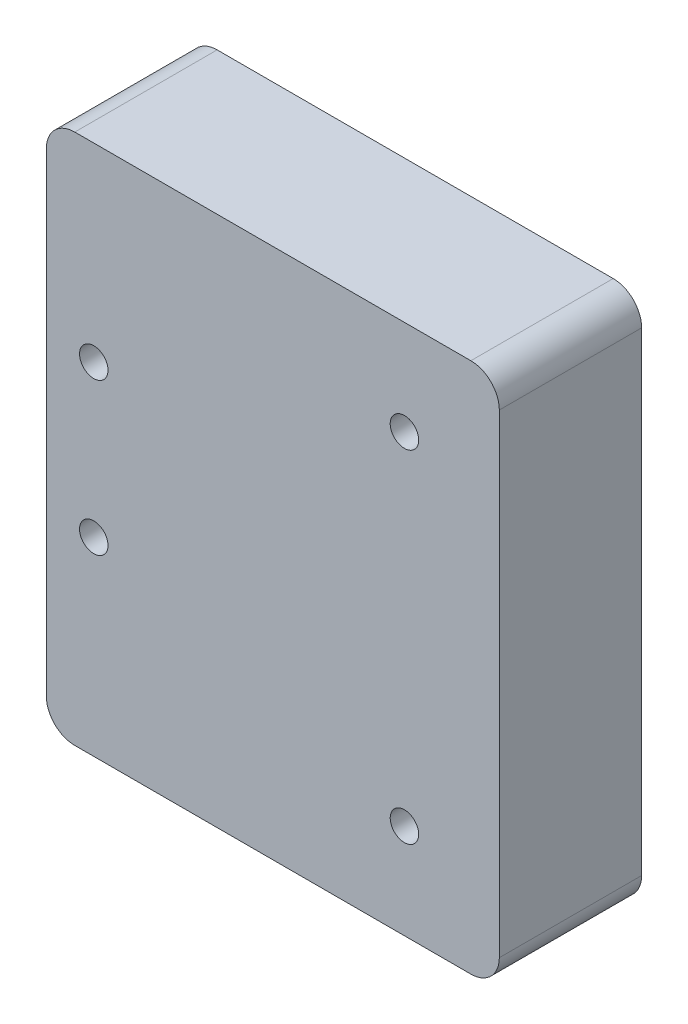
ISO-10303-21;
HEADER;
FILE_DESCRIPTION(('STEP AP214'),'2;1');
FILE_NAME('part.step','',(''),(''),'','','');
FILE_SCHEMA(('AUTOMOTIVE_DESIGN { 1 0 10303 214 1 1 1 1 }'));
ENDSEC;
DATA;
#1=APPLICATION_CONTEXT('core data for automotive mechanical design processes');
#2=APPLICATION_PROTOCOL_DEFINITION('international standard','automotive_design',2000,#1);
#3=PRODUCT_CONTEXT('',#1,'mechanical');
#4=PRODUCT('Part','Part','',(#3));
#5=PRODUCT_RELATED_PRODUCT_CATEGORY('part','',(#4));
#6=PRODUCT_DEFINITION_FORMATION('','',#4);
#7=PRODUCT_DEFINITION_CONTEXT('part definition',#1,'design');
#8=PRODUCT_DEFINITION('design','',#6,#7);
#9=PRODUCT_DEFINITION_SHAPE('','',#8);
#10=(LENGTH_UNIT() NAMED_UNIT(*) SI_UNIT(.MILLI.,.METRE.));
#11=(NAMED_UNIT(*) PLANE_ANGLE_UNIT() SI_UNIT($,.RADIAN.));
#12=(NAMED_UNIT(*) SI_UNIT($,.STERADIAN.) SOLID_ANGLE_UNIT());
#13=UNCERTAINTY_MEASURE_WITH_UNIT(LENGTH_MEASURE(1.E-05),#10,'distance_accuracy_value','');
#14=(GEOMETRIC_REPRESENTATION_CONTEXT(3) GLOBAL_UNCERTAINTY_ASSIGNED_CONTEXT((#13)) GLOBAL_UNIT_ASSIGNED_CONTEXT((#10,
#11,#12)) REPRESENTATION_CONTEXT('',''));
#15=CARTESIAN_POINT('',(0.,0.,0.));
#16=DIRECTION('',(0.,0.,1.));
#17=DIRECTION('',(1.,0.,0.));
#18=AXIS2_PLACEMENT_3D('',#15,#16,#17);
#19=CARTESIAN_POINT('',(0.,0.,15.));
#20=DIRECTION('',(0.,1.,0.));
#21=DIRECTION('',(0.,0.,1.));
#22=AXIS2_PLACEMENT_3D('',#19,#20,#21);
#23=PLANE('',#22);
#24=DIRECTION('',(1.,0.,0.));
#25=VECTOR('',#24,1.);
#26=CARTESIAN_POINT('',(0.,0.,0.));
#27=LINE('',#26,#25);
#28=CARTESIAN_POINT('',(3.,0.,0.));
#29=VERTEX_POINT('',#28);
#30=CARTESIAN_POINT('',(44.739861284283,0.,0.));
#31=VERTEX_POINT('',#30);
#32=EDGE_CURVE('E189',#29,#31,#27,.T.);
#33=ORIENTED_EDGE('',*,*,#32,.T.);
#34=DIRECTION('',(0.,0.,-1.));
#35=VECTOR('',#34,1.);
#36=CARTESIAN_POINT('',(44.739861284283,0.,15.));
#37=LINE('',#36,#35);
#38=CARTESIAN_POINT('',(44.739861284283,0.,15.));
#39=VERTEX_POINT('',#38);
#40=EDGE_CURVE('E204',#31,#39,#37,.F.);
#41=ORIENTED_EDGE('',*,*,#40,.T.);
#42=DIRECTION('',(1.,0.,0.));
#43=VECTOR('',#42,1.);
#44=CARTESIAN_POINT('',(0.,0.,15.));
#45=LINE('',#44,#43);
#46=CARTESIAN_POINT('',(3.,0.,15.));
#47=VERTEX_POINT('',#46);
#48=EDGE_CURVE('E113',#47,#39,#45,.T.);
#49=ORIENTED_EDGE('',*,*,#48,.F.);
#50=DIRECTION('',(0.,0.,-1.));
#51=VECTOR('',#50,1.);
#52=CARTESIAN_POINT('',(3.,0.,15.));
#53=LINE('',#52,#51);
#54=EDGE_CURVE('E201',#47,#29,#53,.T.);
#55=ORIENTED_EDGE('',*,*,#54,.T.);
#56=EDGE_LOOP('',(#33,#41,#49,#55));
#57=FACE_BOUND('',#56,.T.);
#58=ADVANCED_FACE('F35',(#57),#23,.F.);
#59=CARTESIAN_POINT('',(0.,0.,15.));
#60=DIRECTION('',(0.,0.,-1.));
#61=DIRECTION('',(-1.,0.,0.));
#62=AXIS2_PLACEMENT_3D('',#59,#60,#61);
#63=PLANE('',#62);
#64=CARTESIAN_POINT('',(37.739861284283,10.,15.));
#65=DIRECTION('',(0.,0.,1.));
#66=DIRECTION('',(1.,0.,0.));
#67=AXIS2_PLACEMENT_3D('',#64,#65,#66);
#68=CIRCLE('',#67,1.5);
#69=CARTESIAN_POINT('',(39.239861284283,10.,15.));
#70=VERTEX_POINT('',#69);
#71=EDGE_CURVE('E425',#70,#70,#68,.T.);
#72=ORIENTED_EDGE('',*,*,#71,.F.);
#73=EDGE_LOOP('',(#72));
#74=FACE_BOUND('',#73,.T.);
#75=CARTESIAN_POINT('',(5.,20.,15.));
#76=DIRECTION('',(0.,0.,1.));
#77=DIRECTION('',(1.,0.,0.));
#78=AXIS2_PLACEMENT_3D('',#75,#76,#77);
#79=CIRCLE('',#78,1.5);
#80=CARTESIAN_POINT('',(6.5,20.,15.));
#81=VERTEX_POINT('',#80);
#82=EDGE_CURVE('E434',#81,#81,#79,.T.);
#83=ORIENTED_EDGE('',*,*,#82,.F.);
#84=EDGE_LOOP('',(#83));
#85=FACE_BOUND('',#84,.T.);
#86=CARTESIAN_POINT('',(5.,35.9839681310592,15.));
#87=DIRECTION('',(0.,0.,1.));
#88=DIRECTION('',(1.,0.,0.));
#89=AXIS2_PLACEMENT_3D('',#86,#87,#88);
#90=CIRCLE('',#89,1.5);
#91=CARTESIAN_POINT('',(6.5,35.9839681310592,15.));
#92=VERTEX_POINT('',#91);
#93=EDGE_CURVE('E440',#92,#92,#90,.T.);
#94=ORIENTED_EDGE('',*,*,#93,.F.);
#95=EDGE_LOOP('',(#94));
#96=FACE_BOUND('',#95,.T.);
#97=CARTESIAN_POINT('',(37.739861284283,45.9839681310592,15.));
#98=DIRECTION('',(0.,0.,1.));
#99=DIRECTION('',(1.,0.,0.));
#100=AXIS2_PLACEMENT_3D('',#97,#98,#99);
#101=CIRCLE('',#100,1.5);
#102=CARTESIAN_POINT('',(39.239861284283,45.9839681310592,15.));
#103=VERTEX_POINT('',#102);
#104=EDGE_CURVE('E153',#103,#103,#101,.T.);
#105=ORIENTED_EDGE('',*,*,#104,.F.);
#106=EDGE_LOOP('',(#105));
#107=FACE_BOUND('',#106,.T.);
#108=ORIENTED_EDGE('',*,*,#48,.T.);
#109=CARTESIAN_POINT('',(44.739861284283,3.,15.));
#110=DIRECTION('',(0.,0.,-1.));
#111=DIRECTION('',(-1.,0.,0.));
#112=AXIS2_PLACEMENT_3D('',#109,#110,#111);
#113=CIRCLE('',#112,3.);
#114=CARTESIAN_POINT('',(47.739861284283,3.,15.));
#115=VERTEX_POINT('',#114);
#116=EDGE_CURVE('E120',#39,#115,#113,.F.);
#117=ORIENTED_EDGE('',*,*,#116,.T.);
#118=DIRECTION('',(0.,-1.,0.));
#119=VECTOR('',#118,1.);
#120=CARTESIAN_POINT('',(47.739861284283,60.,15.));
#121=LINE('',#120,#119);
#122=CARTESIAN_POINT('',(47.739861284283,52.9839681310592,15.));
#123=VERTEX_POINT('',#122);
#124=EDGE_CURVE('E106',#123,#115,#121,.T.);
#125=ORIENTED_EDGE('',*,*,#124,.F.);
#126=CARTESIAN_POINT('',(44.739861284283,52.9839681310592,15.));
#127=DIRECTION('',(0.,0.,-1.));
#128=DIRECTION('',(-1.,0.,0.));
#129=AXIS2_PLACEMENT_3D('',#126,#127,#128);
#130=CIRCLE('',#129,3.);
#131=CARTESIAN_POINT('',(44.739861284283,55.9839681310592,15.));
#132=VERTEX_POINT('',#131);
#133=EDGE_CURVE('E117',#123,#132,#130,.F.);
#134=ORIENTED_EDGE('',*,*,#133,.T.);
#135=DIRECTION('',(-1.,0.,0.));
#136=VECTOR('',#135,1.);
#137=CARTESIAN_POINT('',(47.739861284283,55.9839681310592,15.));
#138=LINE('',#137,#136);
#139=CARTESIAN_POINT('',(3.,55.9839681310592,15.));
#140=VERTEX_POINT('',#139);
#141=EDGE_CURVE('E141',#132,#140,#138,.T.);
#142=ORIENTED_EDGE('',*,*,#141,.T.);
#143=CARTESIAN_POINT('',(3.,52.9839681310592,15.));
#144=DIRECTION('',(0.,0.,-1.));
#145=DIRECTION('',(-1.,0.,0.));
#146=AXIS2_PLACEMENT_3D('',#143,#144,#145);
#147=CIRCLE('',#146,3.);
#148=CARTESIAN_POINT('',(0.,52.9839681310592,15.));
#149=VERTEX_POINT('',#148);
#150=EDGE_CURVE('E56',#140,#149,#147,.F.);
#151=ORIENTED_EDGE('',*,*,#150,.T.);
#152=DIRECTION('',(0.,-1.,0.));
#153=VECTOR('',#152,1.);
#154=CARTESIAN_POINT('',(0.,0.,15.));
#155=LINE('',#154,#153);
#156=CARTESIAN_POINT('',(0.,3.,15.));
#157=VERTEX_POINT('',#156);
#158=EDGE_CURVE('E187',#149,#157,#155,.T.);
#159=ORIENTED_EDGE('',*,*,#158,.T.);
#160=CARTESIAN_POINT('',(3.,3.,15.));
#161=DIRECTION('',(0.,0.,-1.));
#162=DIRECTION('',(-1.,0.,0.));
#163=AXIS2_PLACEMENT_3D('',#160,#161,#162);
#164=CIRCLE('',#163,3.);
#165=EDGE_CURVE('E130',#157,#47,#164,.F.);
#166=ORIENTED_EDGE('',*,*,#165,.T.);
#167=EDGE_LOOP('',(#108,#117,#125,#134,#142,#151,#159,#166));
#168=FACE_BOUND('',#167,.T.);
#169=ADVANCED_FACE('F116',(#74,#85,#96,#107,#168),#63,.F.);
#170=CARTESIAN_POINT('',(0.,0.,0.));
#171=DIRECTION('',(0.,0.,-1.));
#172=DIRECTION('',(-1.,0.,0.));
#173=AXIS2_PLACEMENT_3D('',#170,#171,#172);
#174=PLANE('',#173);
#175=DIRECTION('',(0.,-1.,0.));
#176=VECTOR('',#175,1.);
#177=CARTESIAN_POINT('',(47.739861284283,60.,0.));
#178=LINE('',#177,#176);
#179=CARTESIAN_POINT('',(47.739861284283,52.9839681310592,0.));
#180=VERTEX_POINT('',#179);
#181=CARTESIAN_POINT('',(47.739861284283,3.,0.));
#182=VERTEX_POINT('',#181);
#183=EDGE_CURVE('E109',#180,#182,#178,.T.);
#184=ORIENTED_EDGE('',*,*,#183,.T.);
#185=CARTESIAN_POINT('',(44.739861284283,3.,0.));
#186=DIRECTION('',(0.,0.,-1.));
#187=DIRECTION('',(-1.,0.,0.));
#188=AXIS2_PLACEMENT_3D('',#185,#186,#187);
#189=CIRCLE('',#188,3.);
#190=EDGE_CURVE('E199',#182,#31,#189,.T.);
#191=ORIENTED_EDGE('',*,*,#190,.T.);
#192=ORIENTED_EDGE('',*,*,#32,.F.);
#193=CARTESIAN_POINT('',(3.,3.,0.));
#194=DIRECTION('',(0.,0.,-1.));
#195=DIRECTION('',(-1.,0.,0.));
#196=AXIS2_PLACEMENT_3D('',#193,#194,#195);
#197=CIRCLE('',#196,3.);
#198=CARTESIAN_POINT('',(0.,3.,0.));
#199=VERTEX_POINT('',#198);
#200=EDGE_CURVE('E195',#29,#199,#197,.T.);
#201=ORIENTED_EDGE('',*,*,#200,.T.);
#202=DIRECTION('',(0.,-1.,0.));
#203=VECTOR('',#202,1.);
#204=CARTESIAN_POINT('',(0.,0.,0.));
#205=LINE('',#204,#203);
#206=CARTESIAN_POINT('',(0.,52.9839681310592,0.));
#207=VERTEX_POINT('',#206);
#208=EDGE_CURVE('E184',#207,#199,#205,.T.);
#209=ORIENTED_EDGE('',*,*,#208,.F.);
#210=CARTESIAN_POINT('',(3.,52.9839681310592,0.));
#211=DIRECTION('',(0.,0.,-1.));
#212=DIRECTION('',(-1.,0.,0.));
#213=AXIS2_PLACEMENT_3D('',#210,#211,#212);
#214=CIRCLE('',#213,3.);
#215=CARTESIAN_POINT('',(3.,55.9839681310592,0.));
#216=VERTEX_POINT('',#215);
#217=EDGE_CURVE('E147',#207,#216,#214,.T.);
#218=ORIENTED_EDGE('',*,*,#217,.T.);
#219=DIRECTION('',(-1.,0.,0.));
#220=VECTOR('',#219,1.);
#221=CARTESIAN_POINT('',(47.739861284283,55.9839681310592,0.));
#222=LINE('',#221,#220);
#223=CARTESIAN_POINT('',(44.739861284283,55.9839681310592,0.));
#224=VERTEX_POINT('',#223);
#225=EDGE_CURVE('E139',#224,#216,#222,.T.);
#226=ORIENTED_EDGE('',*,*,#225,.F.);
#227=CARTESIAN_POINT('',(44.739861284283,52.9839681310592,0.));
#228=DIRECTION('',(0.,0.,-1.));
#229=DIRECTION('',(-1.,0.,0.));
#230=AXIS2_PLACEMENT_3D('',#227,#228,#229);
#231=CIRCLE('',#230,3.);
#232=EDGE_CURVE('E145',#224,#180,#231,.T.);
#233=ORIENTED_EDGE('',*,*,#232,.T.);
#234=EDGE_LOOP('',(#184,#191,#192,#201,#209,#218,#226,#233));
#235=FACE_BOUND('',#234,.T.);
#236=CARTESIAN_POINT('',(10.,19.84,0.));
#237=DIRECTION('',(0.,0.,1.));
#238=DIRECTION('',(1.,0.,0.));
#239=AXIS2_PLACEMENT_3D('',#236,#237,#238);
#240=CIRCLE('',#239,4.25);
#241=CARTESIAN_POINT('',(14.25,19.84,0.));
#242=VERTEX_POINT('',#241);
#243=EDGE_CURVE('E173',#242,#242,#240,.T.);
#244=ORIENTED_EDGE('',*,*,#243,.T.);
#245=EDGE_LOOP('',(#244));
#246=FACE_BOUND('',#245,.T.);
#247=CARTESIAN_POINT('',(24.6449684192217,27.99,0.));
#248=DIRECTION('',(0.,0.,1.));
#249=DIRECTION('',(1.,0.,0.));
#250=AXIS2_PLACEMENT_3D('',#247,#248,#249);
#251=CIRCLE('',#250,5.);
#252=CARTESIAN_POINT('',(29.6449684192217,27.99,0.));
#253=VERTEX_POINT('',#252);
#254=EDGE_CURVE('E121',#253,#253,#251,.T.);
#255=ORIENTED_EDGE('',*,*,#254,.T.);
#256=EDGE_LOOP('',(#255));
#257=FACE_BOUND('',#256,.T.);
#258=CARTESIAN_POINT('',(10.,36.14,0.));
#259=DIRECTION('',(0.,0.,1.));
#260=DIRECTION('',(1.,0.,0.));
#261=AXIS2_PLACEMENT_3D('',#258,#259,#260);
#262=CIRCLE('',#261,4.25);
#263=CARTESIAN_POINT('',(14.25,36.14,0.));
#264=VERTEX_POINT('',#263);
#265=EDGE_CURVE('E172',#264,#264,#262,.T.);
#266=ORIENTED_EDGE('',*,*,#265,.T.);
#267=EDGE_LOOP('',(#266));
#268=FACE_BOUND('',#267,.T.);
#269=ADVANCED_FACE('F143',(#235,#246,#257,#268),#174,.T.);
#270=CARTESIAN_POINT('',(0.,0.,15.));
#271=DIRECTION('',(1.,0.,0.));
#272=DIRECTION('',(0.,0.,-1.));
#273=AXIS2_PLACEMENT_3D('',#270,#271,#272);
#274=PLANE('',#273);
#275=CARTESIAN_POINT('',(0.,48.,7.77996954927929));
#276=DIRECTION('',(1.,0.,0.));
#277=DIRECTION('',(0.,0.,-1.));
#278=AXIS2_PLACEMENT_3D('',#275,#276,#277);
#279=CIRCLE('',#278,4.00000000000001);
#280=CARTESIAN_POINT('',(0.,48.,3.77996954927928));
#281=VERTEX_POINT('',#280);
#282=EDGE_CURVE('E150',#281,#281,#279,.T.);
#283=ORIENTED_EDGE('',*,*,#282,.T.);
#284=EDGE_LOOP('',(#283));
#285=FACE_BOUND('',#284,.T.);
#286=CARTESIAN_POINT('',(0.,8.,7.77996954927929));
#287=DIRECTION('',(1.,0.,0.));
#288=DIRECTION('',(0.,0.,-1.));
#289=AXIS2_PLACEMENT_3D('',#286,#287,#288);
#290=CIRCLE('',#289,4.);
#291=CARTESIAN_POINT('',(0.,8.,3.77996954927929));
#292=VERTEX_POINT('',#291);
#293=EDGE_CURVE('E160',#292,#292,#290,.T.);
#294=ORIENTED_EDGE('',*,*,#293,.T.);
#295=EDGE_LOOP('',(#294));
#296=FACE_BOUND('',#295,.T.);
#297=ORIENTED_EDGE('',*,*,#158,.F.);
#298=DIRECTION('',(0.,0.,-1.));
#299=VECTOR('',#298,1.);
#300=CARTESIAN_POINT('',(0.,52.9839681310592,15.));
#301=LINE('',#300,#299);
#302=EDGE_CURVE('E11',#149,#207,#301,.T.);
#303=ORIENTED_EDGE('',*,*,#302,.T.);
#304=ORIENTED_EDGE('',*,*,#208,.T.);
#305=DIRECTION('',(0.,0.,-1.));
#306=VECTOR('',#305,1.);
#307=CARTESIAN_POINT('',(0.,3.,15.));
#308=LINE('',#307,#306);
#309=EDGE_CURVE('E43',#199,#157,#308,.F.);
#310=ORIENTED_EDGE('',*,*,#309,.T.);
#311=EDGE_LOOP('',(#297,#303,#304,#310));
#312=FACE_BOUND('',#311,.T.);
#313=ADVANCED_FACE('F212',(#285,#296,#312),#274,.F.);
#314=CARTESIAN_POINT('',(10.,36.14,8.));
#315=DIRECTION('',(0.,0.,-1.));
#316=DIRECTION('',(-1.,0.,0.));
#317=AXIS2_PLACEMENT_3D('',#314,#315,#316);
#318=CYLINDRICAL_SURFACE('',#317,4.25);
#319=CARTESIAN_POINT('',(10.,36.14,8.));
#320=DIRECTION('',(0.,0.,1.));
#321=DIRECTION('',(1.,0.,0.));
#322=AXIS2_PLACEMENT_3D('',#319,#320,#321);
#323=CIRCLE('',#322,4.25);
#324=CARTESIAN_POINT('',(14.25,36.14,8.));
#325=VERTEX_POINT('',#324);
#326=EDGE_CURVE('E181',#325,#325,#323,.T.);
#327=ORIENTED_EDGE('',*,*,#326,.T.);
#328=EDGE_LOOP('',(#327));
#329=FACE_BOUND('',#328,.T.);
#330=ORIENTED_EDGE('',*,*,#265,.F.);
#331=EDGE_LOOP('',(#330));
#332=FACE_BOUND('',#331,.T.);
#333=ADVANCED_FACE('F235',(#329,#332),#318,.F.);
#334=CARTESIAN_POINT('',(10.,36.14,8.));
#335=DIRECTION('',(0.,0.,1.));
#336=DIRECTION('',(1.,0.,0.));
#337=AXIS2_PLACEMENT_3D('',#334,#335,#336);
#338=PLANE('',#337);
#339=ORIENTED_EDGE('',*,*,#326,.F.);
#340=EDGE_LOOP('',(#339));
#341=FACE_BOUND('',#340,.T.);
#342=ADVANCED_FACE('F281',(#341),#338,.F.);
#343=CARTESIAN_POINT('',(24.6449684192217,27.99,8.));
#344=DIRECTION('',(0.,0.,-1.));
#345=DIRECTION('',(-1.,0.,0.));
#346=AXIS2_PLACEMENT_3D('',#343,#344,#345);
#347=CYLINDRICAL_SURFACE('',#346,5.);
#348=CARTESIAN_POINT('',(24.6449684192217,27.99,8.));
#349=DIRECTION('',(0.,0.,1.));
#350=DIRECTION('',(1.,0.,0.));
#351=AXIS2_PLACEMENT_3D('',#348,#349,#350);
#352=CIRCLE('',#351,5.);
#353=CARTESIAN_POINT('',(29.6449684192217,27.99,8.));
#354=VERTEX_POINT('',#353);
#355=EDGE_CURVE('E176',#354,#354,#352,.T.);
#356=ORIENTED_EDGE('',*,*,#355,.T.);
#357=EDGE_LOOP('',(#356));
#358=FACE_BOUND('',#357,.T.);
#359=ORIENTED_EDGE('',*,*,#254,.F.);
#360=EDGE_LOOP('',(#359));
#361=FACE_BOUND('',#360,.T.);
#362=ADVANCED_FACE('F277',(#358,#361),#347,.F.);
#363=CARTESIAN_POINT('',(24.6449684192217,27.99,8.));
#364=DIRECTION('',(0.,0.,1.));
#365=DIRECTION('',(1.,0.,0.));
#366=AXIS2_PLACEMENT_3D('',#363,#364,#365);
#367=PLANE('',#366);
#368=ORIENTED_EDGE('',*,*,#355,.F.);
#369=EDGE_LOOP('',(#368));
#370=FACE_BOUND('',#369,.T.);
#371=ADVANCED_FACE('F273',(#370),#367,.F.);
#372=CARTESIAN_POINT('',(10.,19.84,8.));
#373=DIRECTION('',(0.,0.,-1.));
#374=DIRECTION('',(-1.,0.,0.));
#375=AXIS2_PLACEMENT_3D('',#372,#373,#374);
#376=CYLINDRICAL_SURFACE('',#375,4.25);
#377=CARTESIAN_POINT('',(10.,19.84,8.));
#378=DIRECTION('',(0.,0.,1.));
#379=DIRECTION('',(1.,0.,0.));
#380=AXIS2_PLACEMENT_3D('',#377,#378,#379);
#381=CIRCLE('',#380,4.25);
#382=CARTESIAN_POINT('',(14.25,19.84,8.));
#383=VERTEX_POINT('',#382);
#384=EDGE_CURVE('E169',#383,#383,#381,.T.);
#385=ORIENTED_EDGE('',*,*,#384,.T.);
#386=EDGE_LOOP('',(#385));
#387=FACE_BOUND('',#386,.T.);
#388=ORIENTED_EDGE('',*,*,#243,.F.);
#389=EDGE_LOOP('',(#388));
#390=FACE_BOUND('',#389,.T.);
#391=ADVANCED_FACE('F269',(#387,#390),#376,.F.);
#392=CARTESIAN_POINT('',(10.,19.84,8.));
#393=DIRECTION('',(0.,0.,1.));
#394=DIRECTION('',(1.,0.,0.));
#395=AXIS2_PLACEMENT_3D('',#392,#393,#394);
#396=PLANE('',#395);
#397=ORIENTED_EDGE('',*,*,#384,.F.);
#398=EDGE_LOOP('',(#397));
#399=FACE_BOUND('',#398,.T.);
#400=ADVANCED_FACE('F266',(#399),#396,.F.);
#401=CARTESIAN_POINT('',(47.739861284283,60.,15.));
#402=DIRECTION('',(1.,0.,0.));
#403=DIRECTION('',(0.,0.,-1.));
#404=AXIS2_PLACEMENT_3D('',#401,#402,#403);
#405=PLANE('',#404);
#406=ORIENTED_EDGE('',*,*,#124,.T.);
#407=DIRECTION('',(0.,0.,-1.));
#408=VECTOR('',#407,1.);
#409=CARTESIAN_POINT('',(47.739861284283,3.,0.));
#410=LINE('',#409,#408);
#411=EDGE_CURVE('E112',#115,#182,#410,.T.);
#412=ORIENTED_EDGE('',*,*,#411,.T.);
#413=ORIENTED_EDGE('',*,*,#183,.F.);
#414=DIRECTION('',(0.,0.,-1.));
#415=VECTOR('',#414,1.);
#416=CARTESIAN_POINT('',(47.739861284283,52.9839681310592,15.));
#417=LINE('',#416,#415);
#418=EDGE_CURVE('E102',#180,#123,#417,.F.);
#419=ORIENTED_EDGE('',*,*,#418,.T.);
#420=EDGE_LOOP('',(#406,#412,#413,#419));
#421=FACE_BOUND('',#420,.T.);
#422=ADVANCED_FACE('F104',(#421),#405,.T.);
#423=CARTESIAN_POINT('',(8.,8.,7.77996954927929));
#424=DIRECTION('',(-1.,0.,0.));
#425=DIRECTION('',(0.,0.,1.));
#426=AXIS2_PLACEMENT_3D('',#423,#424,#425);
#427=CYLINDRICAL_SURFACE('',#426,4.);
#428=CARTESIAN_POINT('',(8.,8.,7.77996954927929));
#429=DIRECTION('',(1.,0.,0.));
#430=DIRECTION('',(0.,0.,-1.));
#431=AXIS2_PLACEMENT_3D('',#428,#429,#430);
#432=CIRCLE('',#431,4.);
#433=CARTESIAN_POINT('',(8.,8.,3.77996954927929));
#434=VERTEX_POINT('',#433);
#435=EDGE_CURVE('E163',#434,#434,#432,.T.);
#436=ORIENTED_EDGE('',*,*,#435,.T.);
#437=EDGE_LOOP('',(#436));
#438=FACE_BOUND('',#437,.T.);
#439=ORIENTED_EDGE('',*,*,#293,.F.);
#440=EDGE_LOOP('',(#439));
#441=FACE_BOUND('',#440,.T.);
#442=ADVANCED_FACE('F259',(#438,#441),#427,.F.);
#443=CARTESIAN_POINT('',(8.,8.,7.77996954927929));
#444=DIRECTION('',(1.,0.,0.));
#445=DIRECTION('',(0.,0.,-1.));
#446=AXIS2_PLACEMENT_3D('',#443,#444,#445);
#447=PLANE('',#446);
#448=ORIENTED_EDGE('',*,*,#435,.F.);
#449=EDGE_LOOP('',(#448));
#450=FACE_BOUND('',#449,.T.);
#451=ADVANCED_FACE('F255',(#450),#447,.F.);
#452=CARTESIAN_POINT('',(8.,48.,7.77996954927929));
#453=DIRECTION('',(-1.,0.,0.));
#454=DIRECTION('',(0.,0.,1.));
#455=AXIS2_PLACEMENT_3D('',#452,#453,#454);
#456=CYLINDRICAL_SURFACE('',#455,4.00000000000001);
#457=CARTESIAN_POINT('',(8.,48.,7.77996954927929));
#458=DIRECTION('',(1.,0.,0.));
#459=DIRECTION('',(0.,0.,-1.));
#460=AXIS2_PLACEMENT_3D('',#457,#458,#459);
#461=CIRCLE('',#460,4.00000000000001);
#462=CARTESIAN_POINT('',(8.,48.,3.77996954927928));
#463=VERTEX_POINT('',#462);
#464=EDGE_CURVE('E157',#463,#463,#461,.T.);
#465=ORIENTED_EDGE('',*,*,#464,.T.);
#466=EDGE_LOOP('',(#465));
#467=FACE_BOUND('',#466,.T.);
#468=ORIENTED_EDGE('',*,*,#282,.F.);
#469=EDGE_LOOP('',(#468));
#470=FACE_BOUND('',#469,.T.);
#471=ADVANCED_FACE('F247',(#467,#470),#456,.F.);
#472=CARTESIAN_POINT('',(8.,48.,7.77996954927929));
#473=DIRECTION('',(1.,0.,0.));
#474=DIRECTION('',(0.,0.,-1.));
#475=AXIS2_PLACEMENT_3D('',#472,#473,#474);
#476=PLANE('',#475);
#477=ORIENTED_EDGE('',*,*,#464,.F.);
#478=EDGE_LOOP('',(#477));
#479=FACE_BOUND('',#478,.T.);
#480=ADVANCED_FACE('F242',(#479),#476,.F.);
#481=CARTESIAN_POINT('',(47.739861284283,55.9839681310592,15.));
#482=DIRECTION('',(0.,-1.,0.));
#483=DIRECTION('',(0.,0.,-1.));
#484=AXIS2_PLACEMENT_3D('',#481,#482,#483);
#485=PLANE('',#484);
#486=ORIENTED_EDGE('',*,*,#141,.F.);
#487=DIRECTION('',(0.,0.,-1.));
#488=VECTOR('',#487,1.);
#489=CARTESIAN_POINT('',(44.739861284283,55.9839681310592,0.));
#490=LINE('',#489,#488);
#491=EDGE_CURVE('E126',#132,#224,#490,.T.);
#492=ORIENTED_EDGE('',*,*,#491,.T.);
#493=ORIENTED_EDGE('',*,*,#225,.T.);
#494=DIRECTION('',(0.,0.,-1.));
#495=VECTOR('',#494,1.);
#496=CARTESIAN_POINT('',(3.,55.9839681310592,15.));
#497=LINE('',#496,#495);
#498=EDGE_CURVE('E128',#216,#140,#497,.F.);
#499=ORIENTED_EDGE('',*,*,#498,.T.);
#500=EDGE_LOOP('',(#486,#492,#493,#499));
#501=FACE_BOUND('',#500,.T.);
#502=ADVANCED_FACE('F138',(#501),#485,.F.);
#503=CARTESIAN_POINT('',(44.739861284283,3.,15.));
#504=DIRECTION('',(0.,0.,1.));
#505=DIRECTION('',(1.,0.,0.));
#506=AXIS2_PLACEMENT_3D('',#503,#504,#505);
#507=CYLINDRICAL_SURFACE('',#506,3.);
#508=ORIENTED_EDGE('',*,*,#116,.F.);
#509=ORIENTED_EDGE('',*,*,#40,.F.);
#510=ORIENTED_EDGE('',*,*,#190,.F.);
#511=ORIENTED_EDGE('',*,*,#411,.F.);
#512=EDGE_LOOP('',(#508,#509,#510,#511));
#513=FACE_BOUND('',#512,.T.);
#514=ADVANCED_FACE('F222',(#513),#507,.T.);
#515=CARTESIAN_POINT('',(44.739861284283,52.9839681310592,15.));
#516=DIRECTION('',(0.,0.,1.));
#517=DIRECTION('',(1.,0.,0.));
#518=AXIS2_PLACEMENT_3D('',#515,#516,#517);
#519=CYLINDRICAL_SURFACE('',#518,3.);
#520=ORIENTED_EDGE('',*,*,#133,.F.);
#521=ORIENTED_EDGE('',*,*,#418,.F.);
#522=ORIENTED_EDGE('',*,*,#232,.F.);
#523=ORIENTED_EDGE('',*,*,#491,.F.);
#524=EDGE_LOOP('',(#520,#521,#522,#523));
#525=FACE_BOUND('',#524,.T.);
#526=ADVANCED_FACE('F124',(#525),#519,.T.);
#527=CARTESIAN_POINT('',(3.,52.9839681310592,15.));
#528=DIRECTION('',(0.,0.,-1.));
#529=DIRECTION('',(-1.,0.,0.));
#530=AXIS2_PLACEMENT_3D('',#527,#528,#529);
#531=CYLINDRICAL_SURFACE('',#530,3.);
#532=ORIENTED_EDGE('',*,*,#150,.F.);
#533=ORIENTED_EDGE('',*,*,#498,.F.);
#534=ORIENTED_EDGE('',*,*,#217,.F.);
#535=ORIENTED_EDGE('',*,*,#302,.F.);
#536=EDGE_LOOP('',(#532,#533,#534,#535));
#537=FACE_BOUND('',#536,.T.);
#538=ADVANCED_FACE('F215',(#537),#531,.T.);
#539=CARTESIAN_POINT('',(3.,3.,15.));
#540=DIRECTION('',(0.,0.,-1.));
#541=DIRECTION('',(-1.,0.,0.));
#542=AXIS2_PLACEMENT_3D('',#539,#540,#541);
#543=CYLINDRICAL_SURFACE('',#542,3.);
#544=ORIENTED_EDGE('',*,*,#165,.F.);
#545=ORIENTED_EDGE('',*,*,#309,.F.);
#546=ORIENTED_EDGE('',*,*,#200,.F.);
#547=ORIENTED_EDGE('',*,*,#54,.F.);
#548=EDGE_LOOP('',(#544,#545,#546,#547));
#549=FACE_BOUND('',#548,.T.);
#550=ADVANCED_FACE('F37',(#549),#543,.T.);
#551=CARTESIAN_POINT('',(37.739861284283,45.9839681310592,10.));
#552=DIRECTION('',(0.,0.,1.));
#553=DIRECTION('',(1.,0.,0.));
#554=AXIS2_PLACEMENT_3D('',#551,#552,#553);
#555=CYLINDRICAL_SURFACE('',#554,1.5);
#556=CARTESIAN_POINT('',(37.739861284283,45.9839681310592,10.));
#557=DIRECTION('',(0.,0.,1.));
#558=DIRECTION('',(1.,0.,0.));
#559=AXIS2_PLACEMENT_3D('',#556,#557,#558);
#560=CIRCLE('',#559,1.5);
#561=CARTESIAN_POINT('',(39.239861284283,45.9839681310592,10.));
#562=VERTEX_POINT('',#561);
#563=EDGE_CURVE('E148',#562,#562,#560,.T.);
#564=ORIENTED_EDGE('',*,*,#563,.F.);
#565=EDGE_LOOP('',(#564));
#566=FACE_BOUND('',#565,.T.);
#567=ORIENTED_EDGE('',*,*,#104,.T.);
#568=EDGE_LOOP('',(#567));
#569=FACE_BOUND('',#568,.T.);
#570=ADVANCED_FACE('F221',(#566,#569),#555,.F.);
#571=CARTESIAN_POINT('',(37.739861284283,45.9839681310592,10.));
#572=DIRECTION('',(0.,0.,1.));
#573=DIRECTION('',(1.,0.,0.));
#574=AXIS2_PLACEMENT_3D('',#571,#572,#573);
#575=PLANE('',#574);
#576=ORIENTED_EDGE('',*,*,#563,.T.);
#577=EDGE_LOOP('',(#576));
#578=FACE_BOUND('',#577,.T.);
#579=ADVANCED_FACE('F350',(#578),#575,.T.);
#580=CARTESIAN_POINT('',(5.,35.9839681310592,10.));
#581=DIRECTION('',(0.,0.,1.));
#582=DIRECTION('',(1.,0.,0.));
#583=AXIS2_PLACEMENT_3D('',#580,#581,#582);
#584=CYLINDRICAL_SURFACE('',#583,1.5);
#585=CARTESIAN_POINT('',(5.,35.9839681310592,10.));
#586=DIRECTION('',(0.,0.,1.));
#587=DIRECTION('',(1.,0.,0.));
#588=AXIS2_PLACEMENT_3D('',#585,#586,#587);
#589=CIRCLE('',#588,1.5);
#590=CARTESIAN_POINT('',(6.5,35.9839681310592,10.));
#591=VERTEX_POINT('',#590);
#592=EDGE_CURVE('E437',#591,#591,#589,.T.);
#593=ORIENTED_EDGE('',*,*,#592,.F.);
#594=EDGE_LOOP('',(#593));
#595=FACE_BOUND('',#594,.T.);
#596=ORIENTED_EDGE('',*,*,#93,.T.);
#597=EDGE_LOOP('',(#596));
#598=FACE_BOUND('',#597,.T.);
#599=ADVANCED_FACE('F359',(#595,#598),#584,.F.);
#600=CARTESIAN_POINT('',(5.,35.9839681310592,10.));
#601=DIRECTION('',(0.,0.,1.));
#602=DIRECTION('',(1.,0.,0.));
#603=AXIS2_PLACEMENT_3D('',#600,#601,#602);
#604=PLANE('',#603);
#605=ORIENTED_EDGE('',*,*,#592,.T.);
#606=EDGE_LOOP('',(#605));
#607=FACE_BOUND('',#606,.T.);
#608=ADVANCED_FACE('F368',(#607),#604,.T.);
#609=CARTESIAN_POINT('',(5.,20.,10.));
#610=DIRECTION('',(0.,0.,1.));
#611=DIRECTION('',(1.,0.,0.));
#612=AXIS2_PLACEMENT_3D('',#609,#610,#611);
#613=CYLINDRICAL_SURFACE('',#612,1.5);
#614=CARTESIAN_POINT('',(5.,20.,10.));
#615=DIRECTION('',(0.,0.,1.));
#616=DIRECTION('',(1.,0.,0.));
#617=AXIS2_PLACEMENT_3D('',#614,#615,#616);
#618=CIRCLE('',#617,1.5);
#619=CARTESIAN_POINT('',(6.5,20.,10.));
#620=VERTEX_POINT('',#619);
#621=EDGE_CURVE('E429',#620,#620,#618,.T.);
#622=ORIENTED_EDGE('',*,*,#621,.F.);
#623=EDGE_LOOP('',(#622));
#624=FACE_BOUND('',#623,.T.);
#625=ORIENTED_EDGE('',*,*,#82,.T.);
#626=EDGE_LOOP('',(#625));
#627=FACE_BOUND('',#626,.T.);
#628=ADVANCED_FACE('F378',(#624,#627),#613,.F.);
#629=CARTESIAN_POINT('',(5.,20.,10.));
#630=DIRECTION('',(0.,0.,1.));
#631=DIRECTION('',(1.,0.,0.));
#632=AXIS2_PLACEMENT_3D('',#629,#630,#631);
#633=PLANE('',#632);
#634=ORIENTED_EDGE('',*,*,#621,.T.);
#635=EDGE_LOOP('',(#634));
#636=FACE_BOUND('',#635,.T.);
#637=ADVANCED_FACE('F388',(#636),#633,.T.);
#638=CARTESIAN_POINT('',(37.739861284283,10.,10.));
#639=DIRECTION('',(0.,0.,1.));
#640=DIRECTION('',(1.,0.,0.));
#641=AXIS2_PLACEMENT_3D('',#638,#639,#640);
#642=CYLINDRICAL_SURFACE('',#641,1.5);
#643=CARTESIAN_POINT('',(37.739861284283,10.,10.));
#644=DIRECTION('',(0.,0.,1.));
#645=DIRECTION('',(1.,0.,0.));
#646=AXIS2_PLACEMENT_3D('',#643,#644,#645);
#647=CIRCLE('',#646,1.5);
#648=CARTESIAN_POINT('',(39.239861284283,10.,10.));
#649=VERTEX_POINT('',#648);
#650=EDGE_CURVE('E424',#649,#649,#647,.T.);
#651=ORIENTED_EDGE('',*,*,#650,.F.);
#652=EDGE_LOOP('',(#651));
#653=FACE_BOUND('',#652,.T.);
#654=ORIENTED_EDGE('',*,*,#71,.T.);
#655=EDGE_LOOP('',(#654));
#656=FACE_BOUND('',#655,.T.);
#657=ADVANCED_FACE('F398',(#653,#656),#642,.F.);
#658=CARTESIAN_POINT('',(37.739861284283,10.,10.));
#659=DIRECTION('',(0.,0.,1.));
#660=DIRECTION('',(1.,0.,0.));
#661=AXIS2_PLACEMENT_3D('',#658,#659,#660);
#662=PLANE('',#661);
#663=ORIENTED_EDGE('',*,*,#650,.T.);
#664=EDGE_LOOP('',(#663));
#665=FACE_BOUND('',#664,.T.);
#666=ADVANCED_FACE('F408',(#665),#662,.T.);
#667=CLOSED_SHELL('',(#58,#169,#269,#313,#333,#342,#362,#371,#391,#400,#422,#442,#451,#471,#480,
#502,#514,#526,#538,#550,#570,#579,#599,#608,#628,#637,#657,#666));
#668=MANIFOLD_SOLID_BREP('B2',#667);
#669=ADVANCED_BREP_SHAPE_REPRESENTATION('',(#18,#668),#14);
#670=SHAPE_DEFINITION_REPRESENTATION(#9,#669);
ENDSEC;
END-ISO-10303-21;
